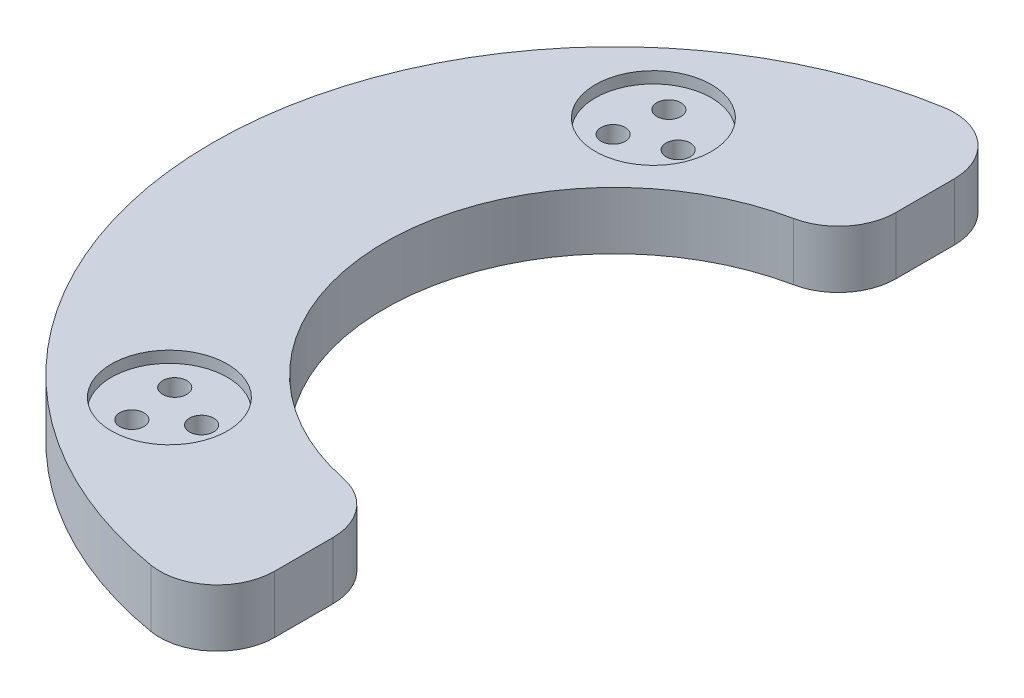
ISO-10303-21;
HEADER;
FILE_DESCRIPTION(('STEP AP214'),'2;1');
FILE_NAME('part.step','',(''),(''),'','','');
FILE_SCHEMA(('AUTOMOTIVE_DESIGN { 1 0 10303 214 1 1 1 1 }'));
ENDSEC;
DATA;
#1=APPLICATION_CONTEXT('core data for automotive mechanical design processes');
#2=APPLICATION_PROTOCOL_DEFINITION('international standard','automotive_design',2000,#1);
#3=PRODUCT_CONTEXT('',#1,'mechanical');
#4=PRODUCT('Part','Part','',(#3));
#5=PRODUCT_RELATED_PRODUCT_CATEGORY('part','',(#4));
#6=PRODUCT_DEFINITION_FORMATION('','',#4);
#7=PRODUCT_DEFINITION_CONTEXT('part definition',#1,'design');
#8=PRODUCT_DEFINITION('design','',#6,#7);
#9=PRODUCT_DEFINITION_SHAPE('','',#8);
#10=(LENGTH_UNIT() NAMED_UNIT(*) SI_UNIT(.MILLI.,.METRE.));
#11=(NAMED_UNIT(*) PLANE_ANGLE_UNIT() SI_UNIT($,.RADIAN.));
#12=(NAMED_UNIT(*) SI_UNIT($,.STERADIAN.) SOLID_ANGLE_UNIT());
#13=UNCERTAINTY_MEASURE_WITH_UNIT(LENGTH_MEASURE(1.E-05),#10,'distance_accuracy_value','');
#14=(GEOMETRIC_REPRESENTATION_CONTEXT(3) GLOBAL_UNCERTAINTY_ASSIGNED_CONTEXT((#13)) GLOBAL_UNIT_ASSIGNED_CONTEXT((#10,
#11,#12)) REPRESENTATION_CONTEXT('',''));
#15=CARTESIAN_POINT('',(0.,0.,0.));
#16=DIRECTION('',(0.,0.,1.));
#17=DIRECTION('',(1.,0.,0.));
#18=AXIS2_PLACEMENT_3D('',#15,#16,#17);
#19=CARTESIAN_POINT('',(0.,10.,0.));
#20=DIRECTION('',(0.,1.,0.));
#21=DIRECTION('',(0.,0.,1.));
#22=AXIS2_PLACEMENT_3D('',#19,#20,#21);
#23=PLANE('',#22);
#24=CARTESIAN_POINT('',(-35.3533185327597,10.,-42.1324443715437));
#25=DIRECTION('',(0.,-1.,0.));
#26=DIRECTION('',(0.,0.,-1.));
#27=AXIS2_PLACEMENT_3D('',#24,#25,#26);
#28=CIRCLE('',#27,10.1);
#29=CARTESIAN_POINT('',(-35.3533185327597,10.,-52.2324443715437));
#30=VERTEX_POINT('',#29);
#31=EDGE_CURVE('E311',#30,#30,#28,.T.);
#32=ORIENTED_EDGE('',*,*,#31,.T.);
#33=EDGE_LOOP('',(#32));
#34=FACE_BOUND('',#33,.T.);
#35=CARTESIAN_POINT('',(-35.3533185327597,10.,42.1324443715437));
#36=DIRECTION('',(0.,1.,0.));
#37=DIRECTION('',(0.,0.,1.));
#38=AXIS2_PLACEMENT_3D('',#35,#36,#37);
#39=CIRCLE('',#38,10.1);
#40=CARTESIAN_POINT('',(-35.3533185327597,10.,52.2324443715437));
#41=VERTEX_POINT('',#40);
#42=EDGE_CURVE('E165',#41,#41,#39,.T.);
#43=ORIENTED_EDGE('',*,*,#42,.F.);
#44=EDGE_LOOP('',(#43));
#45=FACE_BOUND('',#44,.T.);
#46=DIRECTION('',(0.,0.,1.));
#47=VECTOR('',#46,1.);
#48=CARTESIAN_POINT('',(0.,10.,155.526666229488));
#49=LINE('',#48,#47);
#50=CARTESIAN_POINT('',(0.,10.,-59.1607978309962));
#51=VERTEX_POINT('',#50);
#52=CARTESIAN_POINT('',(0.,10.,-48.9897948556636));
#53=VERTEX_POINT('',#52);
#54=EDGE_CURVE('E104',#51,#53,#49,.T.);
#55=ORIENTED_EDGE('',*,*,#54,.F.);
#56=CARTESIAN_POINT('',(-10.,10.,-59.1607978309962));
#57=DIRECTION('',(0.,1.,0.));
#58=DIRECTION('',(0.,0.,1.));
#59=AXIS2_PLACEMENT_3D('',#56,#57,#58);
#60=CIRCLE('',#59,10.);
#61=CARTESIAN_POINT('',(-11.6666666666667,10.,-69.0209308028289));
#62=VERTEX_POINT('',#61);
#63=EDGE_CURVE('E100',#51,#62,#60,.T.);
#64=ORIENTED_EDGE('',*,*,#63,.T.);
#65=CARTESIAN_POINT('',(0.,10.,0.));
#66=DIRECTION('',(0.,1.,0.));
#67=DIRECTION('',(0.,0.,1.));
#68=AXIS2_PLACEMENT_3D('',#65,#66,#67);
#69=CIRCLE('',#68,70.);
#70=CARTESIAN_POINT('',(-11.6666666666667,10.,69.0209308028289));
#71=VERTEX_POINT('',#70);
#72=EDGE_CURVE('E102',#62,#71,#69,.T.);
#73=ORIENTED_EDGE('',*,*,#72,.T.);
#74=CARTESIAN_POINT('',(-10.,10.,59.1607978309962));
#75=DIRECTION('',(0.,1.,0.));
#76=DIRECTION('',(0.,0.,1.));
#77=AXIS2_PLACEMENT_3D('',#74,#75,#76);
#78=CIRCLE('',#77,10.);
#79=CARTESIAN_POINT('',(0.,10.,59.1607978309962));
#80=VERTEX_POINT('',#79);
#81=EDGE_CURVE('E140',#71,#80,#78,.T.);
#82=ORIENTED_EDGE('',*,*,#81,.T.);
#83=CARTESIAN_POINT('',(0.,10.,48.9897948556636));
#84=VERTEX_POINT('',#83);
#85=EDGE_CURVE('E153',#84,#80,#49,.T.);
#86=ORIENTED_EDGE('',*,*,#85,.F.);
#87=CARTESIAN_POINT('',(-10.,10.,48.9897948556636));
#88=DIRECTION('',(0.,1.,0.));
#89=DIRECTION('',(0.,0.,1.));
#90=AXIS2_PLACEMENT_3D('',#87,#88,#89);
#91=CIRCLE('',#90,10.);
#92=CARTESIAN_POINT('',(-8.,10.,39.1918358845309));
#93=VERTEX_POINT('',#92);
#94=EDGE_CURVE('E49',#84,#93,#91,.T.);
#95=ORIENTED_EDGE('',*,*,#94,.T.);
#96=CARTESIAN_POINT('',(0.,10.,0.));
#97=DIRECTION('',(0.,1.,0.));
#98=DIRECTION('',(0.,0.,1.));
#99=AXIS2_PLACEMENT_3D('',#96,#97,#98);
#100=CIRCLE('',#99,40.);
#101=CARTESIAN_POINT('',(-8.,10.,-39.1918358845309));
#102=VERTEX_POINT('',#101);
#103=EDGE_CURVE('E169',#102,#93,#100,.T.);
#104=ORIENTED_EDGE('',*,*,#103,.F.);
#105=CARTESIAN_POINT('',(-10.,10.,-48.9897948556636));
#106=DIRECTION('',(0.,1.,0.));
#107=DIRECTION('',(0.,0.,1.));
#108=AXIS2_PLACEMENT_3D('',#105,#106,#107);
#109=CIRCLE('',#108,10.);
#110=EDGE_CURVE('E109',#102,#53,#109,.T.);
#111=ORIENTED_EDGE('',*,*,#110,.T.);
#112=EDGE_LOOP('',(#55,#64,#73,#82,#86,#95,#104,#111));
#113=FACE_BOUND('',#112,.T.);
#114=ADVANCED_FACE('F34',(#34,#45,#113),#23,.T.);
#115=CARTESIAN_POINT('',(0.,0.,0.));
#116=DIRECTION('',(0.,1.,0.));
#117=DIRECTION('',(0.,0.,1.));
#118=AXIS2_PLACEMENT_3D('',#115,#116,#117);
#119=PLANE('',#118);
#120=CARTESIAN_POINT('',(-37.2738042409347,0.,-46.7489078063275));
#121=DIRECTION('',(0.,1.,0.));
#122=DIRECTION('',(0.,0.,1.));
#123=AXIS2_PLACEMENT_3D('',#120,#121,#122);
#124=CIRCLE('',#123,2.1);
#125=CARTESIAN_POINT('',(-37.2738042409347,0.,-44.6489078063275));
#126=VERTEX_POINT('',#125);
#127=EDGE_CURVE('E336',#126,#126,#124,.F.);
#128=ORIENTED_EDGE('',*,*,#127,.F.);
#129=EDGE_LOOP('',(#128));
#130=FACE_BOUND('',#129,.T.);
#131=CARTESIAN_POINT('',(-30.3951010685075,0.,-41.4874020650363));
#132=DIRECTION('',(0.,1.,0.));
#133=DIRECTION('',(0.,0.,1.));
#134=AXIS2_PLACEMENT_3D('',#131,#132,#133);
#135=CIRCLE('',#134,2.1);
#136=CARTESIAN_POINT('',(-30.3951010685075,0.,-39.3874020650363));
#137=VERTEX_POINT('',#136);
#138=EDGE_CURVE('E341',#137,#137,#135,.F.);
#139=ORIENTED_EDGE('',*,*,#138,.F.);
#140=EDGE_LOOP('',(#139));
#141=FACE_BOUND('',#140,.T.);
#142=CARTESIAN_POINT('',(-38.3910502888369,0.,-38.1610232432674));
#143=DIRECTION('',(0.,1.,0.));
#144=DIRECTION('',(0.,0.,1.));
#145=AXIS2_PLACEMENT_3D('',#142,#143,#144);
#146=CIRCLE('',#145,2.1);
#147=CARTESIAN_POINT('',(-38.3910502888369,0.,-36.0610232432674));
#148=VERTEX_POINT('',#147);
#149=EDGE_CURVE('E344',#148,#148,#146,.F.);
#150=ORIENTED_EDGE('',*,*,#149,.F.);
#151=EDGE_LOOP('',(#150));
#152=FACE_BOUND('',#151,.T.);
#153=CARTESIAN_POINT('',(-37.2738042409347,0.,46.7489078063275));
#154=DIRECTION('',(0.,1.,0.));
#155=DIRECTION('',(0.,0.,1.));
#156=AXIS2_PLACEMENT_3D('',#153,#154,#155);
#157=CIRCLE('',#156,2.1);
#158=CARTESIAN_POINT('',(-37.2738042409347,0.,48.8489078063275));
#159=VERTEX_POINT('',#158);
#160=EDGE_CURVE('E309',#159,#159,#157,.T.);
#161=ORIENTED_EDGE('',*,*,#160,.T.);
#162=EDGE_LOOP('',(#161));
#163=FACE_BOUND('',#162,.T.);
#164=CARTESIAN_POINT('',(-30.3951010685075,0.,41.4874020650363));
#165=DIRECTION('',(0.,1.,0.));
#166=DIRECTION('',(0.,0.,1.));
#167=AXIS2_PLACEMENT_3D('',#164,#165,#166);
#168=CIRCLE('',#167,2.1);
#169=CARTESIAN_POINT('',(-30.3951010685075,0.,43.5874020650363));
#170=VERTEX_POINT('',#169);
#171=EDGE_CURVE('E312',#170,#170,#168,.T.);
#172=ORIENTED_EDGE('',*,*,#171,.T.);
#173=EDGE_LOOP('',(#172));
#174=FACE_BOUND('',#173,.T.);
#175=CARTESIAN_POINT('',(-38.3910502888369,0.,38.1610232432674));
#176=DIRECTION('',(0.,1.,0.));
#177=DIRECTION('',(0.,0.,1.));
#178=AXIS2_PLACEMENT_3D('',#175,#176,#177);
#179=CIRCLE('',#178,2.1);
#180=CARTESIAN_POINT('',(-38.3910502888369,0.,40.2610232432674));
#181=VERTEX_POINT('',#180);
#182=EDGE_CURVE('E317',#181,#181,#179,.T.);
#183=ORIENTED_EDGE('',*,*,#182,.T.);
#184=EDGE_LOOP('',(#183));
#185=FACE_BOUND('',#184,.T.);
#186=CARTESIAN_POINT('',(0.,0.,0.));
#187=DIRECTION('',(0.,1.,0.));
#188=DIRECTION('',(0.,0.,1.));
#189=AXIS2_PLACEMENT_3D('',#186,#187,#188);
#190=CIRCLE('',#189,70.);
#191=CARTESIAN_POINT('',(-11.6666666666667,0.,-69.0209308028289));
#192=VERTEX_POINT('',#191);
#193=CARTESIAN_POINT('',(-11.6666666666667,0.,69.0209308028289));
#194=VERTEX_POINT('',#193);
#195=EDGE_CURVE('E120',#192,#194,#190,.T.);
#196=ORIENTED_EDGE('',*,*,#195,.F.);
#197=CARTESIAN_POINT('',(-10.,0.,-59.1607978309962));
#198=DIRECTION('',(0.,1.,0.));
#199=DIRECTION('',(0.,0.,1.));
#200=AXIS2_PLACEMENT_3D('',#197,#198,#199);
#201=CIRCLE('',#200,10.);
#202=CARTESIAN_POINT('',(0.,0.,-59.1607978309962));
#203=VERTEX_POINT('',#202);
#204=EDGE_CURVE('E123',#192,#203,#201,.F.);
#205=ORIENTED_EDGE('',*,*,#204,.T.);
#206=DIRECTION('',(0.,0.,1.));
#207=VECTOR('',#206,1.);
#208=CARTESIAN_POINT('',(0.,0.,0.));
#209=LINE('',#208,#207);
#210=CARTESIAN_POINT('',(0.,0.,-48.9897948556636));
#211=VERTEX_POINT('',#210);
#212=EDGE_CURVE('E160',#203,#211,#209,.T.);
#213=ORIENTED_EDGE('',*,*,#212,.T.);
#214=CARTESIAN_POINT('',(-10.,0.,-48.9897948556636));
#215=DIRECTION('',(0.,1.,0.));
#216=DIRECTION('',(0.,0.,1.));
#217=AXIS2_PLACEMENT_3D('',#214,#215,#216);
#218=CIRCLE('',#217,10.);
#219=CARTESIAN_POINT('',(-8.,0.,-39.1918358845309));
#220=VERTEX_POINT('',#219);
#221=EDGE_CURVE('E132',#211,#220,#218,.F.);
#222=ORIENTED_EDGE('',*,*,#221,.T.);
#223=CARTESIAN_POINT('',(0.,0.,0.));
#224=DIRECTION('',(0.,1.,0.));
#225=DIRECTION('',(0.,0.,1.));
#226=AXIS2_PLACEMENT_3D('',#223,#224,#225);
#227=CIRCLE('',#226,40.);
#228=CARTESIAN_POINT('',(-8.,0.,39.1918358845309));
#229=VERTEX_POINT('',#228);
#230=EDGE_CURVE('E171',#220,#229,#227,.T.);
#231=ORIENTED_EDGE('',*,*,#230,.T.);
#232=CARTESIAN_POINT('',(-10.,0.,48.9897948556636));
#233=DIRECTION('',(0.,1.,0.));
#234=DIRECTION('',(0.,0.,1.));
#235=AXIS2_PLACEMENT_3D('',#232,#233,#234);
#236=CIRCLE('',#235,10.);
#237=CARTESIAN_POINT('',(0.,0.,48.9897948556636));
#238=VERTEX_POINT('',#237);
#239=EDGE_CURVE('E126',#229,#238,#236,.F.);
#240=ORIENTED_EDGE('',*,*,#239,.T.);
#241=CARTESIAN_POINT('',(0.,0.,59.1607978309962));
#242=VERTEX_POINT('',#241);
#243=EDGE_CURVE('E151',#238,#242,#209,.T.);
#244=ORIENTED_EDGE('',*,*,#243,.T.);
#245=CARTESIAN_POINT('',(-10.,0.,59.1607978309962));
#246=DIRECTION('',(0.,1.,0.));
#247=DIRECTION('',(0.,0.,1.));
#248=AXIS2_PLACEMENT_3D('',#245,#246,#247);
#249=CIRCLE('',#248,10.);
#250=EDGE_CURVE('E124',#242,#194,#249,.F.);
#251=ORIENTED_EDGE('',*,*,#250,.T.);
#252=EDGE_LOOP('',(#196,#205,#213,#222,#231,#240,#244,#251));
#253=FACE_BOUND('',#252,.T.);
#254=ADVANCED_FACE('F157',(#130,#141,#152,#163,#174,#185,#253),#119,.F.);
#255=CARTESIAN_POINT('',(0.,10.,0.));
#256=DIRECTION('',(0.,-1.,0.));
#257=DIRECTION('',(0.,0.,-1.));
#258=AXIS2_PLACEMENT_3D('',#255,#256,#257);
#259=CYLINDRICAL_SURFACE('',#258,70.);
#260=ORIENTED_EDGE('',*,*,#72,.F.);
#261=DIRECTION('',(0.,-1.,0.));
#262=VECTOR('',#261,1.);
#263=CARTESIAN_POINT('',(-11.6666666666667,10.,-69.0209308028289));
#264=LINE('',#263,#262);
#265=EDGE_CURVE('E116',#62,#192,#264,.T.);
#266=ORIENTED_EDGE('',*,*,#265,.T.);
#267=ORIENTED_EDGE('',*,*,#195,.T.);
#268=DIRECTION('',(0.,-1.,0.));
#269=VECTOR('',#268,1.);
#270=CARTESIAN_POINT('',(-11.6666666666667,10.,69.0209308028289));
#271=LINE('',#270,#269);
#272=EDGE_CURVE('E119',#194,#71,#271,.F.);
#273=ORIENTED_EDGE('',*,*,#272,.T.);
#274=EDGE_LOOP('',(#260,#266,#267,#273));
#275=FACE_BOUND('',#274,.T.);
#276=ADVANCED_FACE('F114',(#275),#259,.T.);
#277=CARTESIAN_POINT('',(0.,10.,0.));
#278=DIRECTION('',(0.,-1.,0.));
#279=DIRECTION('',(0.,0.,-1.));
#280=AXIS2_PLACEMENT_3D('',#277,#278,#279);
#281=CYLINDRICAL_SURFACE('',#280,40.);
#282=ORIENTED_EDGE('',*,*,#230,.F.);
#283=DIRECTION('',(0.,-1.,0.));
#284=VECTOR('',#283,1.);
#285=CARTESIAN_POINT('',(-8.,10.,-39.1918358845309));
#286=LINE('',#285,#284);
#287=EDGE_CURVE('E56',#220,#102,#286,.F.);
#288=ORIENTED_EDGE('',*,*,#287,.T.);
#289=ORIENTED_EDGE('',*,*,#103,.T.);
#290=DIRECTION('',(0.,-1.,0.));
#291=VECTOR('',#290,1.);
#292=CARTESIAN_POINT('',(-8.,10.,39.1918358845309));
#293=LINE('',#292,#291);
#294=EDGE_CURVE('E108',#93,#229,#293,.T.);
#295=ORIENTED_EDGE('',*,*,#294,.T.);
#296=EDGE_LOOP('',(#282,#288,#289,#295));
#297=FACE_BOUND('',#296,.T.);
#298=ADVANCED_FACE('F180',(#297),#281,.F.);
#299=CARTESIAN_POINT('',(0.,-52.,155.526666229488));
#300=DIRECTION('',(-1.,0.,0.));
#301=DIRECTION('',(0.,0.,1.));
#302=AXIS2_PLACEMENT_3D('',#299,#300,#301);
#303=PLANE('',#302);
#304=ORIENTED_EDGE('',*,*,#243,.F.);
#305=DIRECTION('',(0.,1.,0.));
#306=VECTOR('',#305,1.);
#307=CARTESIAN_POINT('',(0.,10.,48.9897948556636));
#308=LINE('',#307,#306);
#309=EDGE_CURVE('E11',#238,#84,#308,.T.);
#310=ORIENTED_EDGE('',*,*,#309,.T.);
#311=ORIENTED_EDGE('',*,*,#85,.T.);
#312=DIRECTION('',(0.,-1.,0.));
#313=VECTOR('',#312,1.);
#314=CARTESIAN_POINT('',(0.,-52.,59.1607978309962));
#315=LINE('',#314,#313);
#316=EDGE_CURVE('E42',#80,#242,#315,.T.);
#317=ORIENTED_EDGE('',*,*,#316,.T.);
#318=EDGE_LOOP('',(#304,#310,#311,#317));
#319=FACE_BOUND('',#318,.T.);
#320=ADVANCED_FACE('F150',(#319),#303,.F.);
#321=ORIENTED_EDGE('',*,*,#212,.F.);
#322=DIRECTION('',(0.,-1.,0.));
#323=VECTOR('',#322,1.);
#324=CARTESIAN_POINT('',(0.,-52.,-59.1607978309962));
#325=LINE('',#324,#323);
#326=EDGE_CURVE('E138',#203,#51,#325,.F.);
#327=ORIENTED_EDGE('',*,*,#326,.T.);
#328=ORIENTED_EDGE('',*,*,#54,.T.);
#329=DIRECTION('',(0.,1.,0.));
#330=VECTOR('',#329,1.);
#331=CARTESIAN_POINT('',(0.,0.,-48.9897948556636));
#332=LINE('',#331,#330);
#333=EDGE_CURVE('E135',#53,#211,#332,.F.);
#334=ORIENTED_EDGE('',*,*,#333,.T.);
#335=EDGE_LOOP('',(#321,#327,#328,#334));
#336=FACE_BOUND('',#335,.T.);
#337=ADVANCED_FACE('F175',(#336),#303,.F.);
#338=CARTESIAN_POINT('',(-35.3533185327597,8.,42.1324443715437));
#339=DIRECTION('',(0.,1.,0.));
#340=DIRECTION('',(0.,0.,1.));
#341=AXIS2_PLACEMENT_3D('',#338,#339,#340);
#342=CYLINDRICAL_SURFACE('',#341,10.1);
#343=CARTESIAN_POINT('',(-35.3533185327597,8.,42.1324443715437));
#344=DIRECTION('',(0.,1.,0.));
#345=DIRECTION('',(0.,0.,1.));
#346=AXIS2_PLACEMENT_3D('',#343,#344,#345);
#347=CIRCLE('',#346,10.1);
#348=CARTESIAN_POINT('',(-35.3533185327597,8.,52.2324443715437));
#349=VERTEX_POINT('',#348);
#350=EDGE_CURVE('E162',#349,#349,#347,.T.);
#351=ORIENTED_EDGE('',*,*,#350,.F.);
#352=EDGE_LOOP('',(#351));
#353=FACE_BOUND('',#352,.T.);
#354=ORIENTED_EDGE('',*,*,#42,.T.);
#355=EDGE_LOOP('',(#354));
#356=FACE_BOUND('',#355,.T.);
#357=ADVANCED_FACE('F227',(#353,#356),#342,.F.);
#358=CARTESIAN_POINT('',(-35.3533185327597,8.,42.1324443715437));
#359=DIRECTION('',(0.,1.,0.));
#360=DIRECTION('',(0.,0.,1.));
#361=AXIS2_PLACEMENT_3D('',#358,#359,#360);
#362=PLANE('',#361);
#363=CARTESIAN_POINT('',(-37.2738042409347,8.,46.7489078063275));
#364=DIRECTION('',(0.,1.,0.));
#365=DIRECTION('',(0.,0.,1.));
#366=AXIS2_PLACEMENT_3D('',#363,#364,#365);
#367=CIRCLE('',#366,2.1);
#368=CARTESIAN_POINT('',(-37.2738042409347,8.,48.8489078063275));
#369=VERTEX_POINT('',#368);
#370=EDGE_CURVE('E306',#369,#369,#367,.T.);
#371=ORIENTED_EDGE('',*,*,#370,.F.);
#372=EDGE_LOOP('',(#371));
#373=FACE_BOUND('',#372,.T.);
#374=CARTESIAN_POINT('',(-30.3951010685075,8.,41.4874020650363));
#375=DIRECTION('',(0.,1.,0.));
#376=DIRECTION('',(0.,0.,1.));
#377=AXIS2_PLACEMENT_3D('',#374,#375,#376);
#378=CIRCLE('',#377,2.1);
#379=CARTESIAN_POINT('',(-30.3951010685075,8.,43.5874020650363));
#380=VERTEX_POINT('',#379);
#381=EDGE_CURVE('E334',#380,#380,#378,.T.);
#382=ORIENTED_EDGE('',*,*,#381,.F.);
#383=EDGE_LOOP('',(#382));
#384=FACE_BOUND('',#383,.T.);
#385=CARTESIAN_POINT('',(-38.3910502888369,8.,38.1610232432674));
#386=DIRECTION('',(0.,1.,0.));
#387=DIRECTION('',(0.,0.,1.));
#388=AXIS2_PLACEMENT_3D('',#385,#386,#387);
#389=CIRCLE('',#388,2.1);
#390=CARTESIAN_POINT('',(-38.3910502888369,8.,40.2610232432674));
#391=VERTEX_POINT('',#390);
#392=EDGE_CURVE('E331',#391,#391,#389,.T.);
#393=ORIENTED_EDGE('',*,*,#392,.F.);
#394=EDGE_LOOP('',(#393));
#395=FACE_BOUND('',#394,.T.);
#396=ORIENTED_EDGE('',*,*,#350,.T.);
#397=EDGE_LOOP('',(#396));
#398=FACE_BOUND('',#397,.T.);
#399=ADVANCED_FACE('F217',(#373,#384,#395,#398),#362,.T.);
#400=CARTESIAN_POINT('',(-35.3533185327597,8.,-42.1324443715437));
#401=DIRECTION('',(0.,1.,0.));
#402=DIRECTION('',(0.,0.,1.));
#403=AXIS2_PLACEMENT_3D('',#400,#401,#402);
#404=CYLINDRICAL_SURFACE('',#403,10.1);
#405=CARTESIAN_POINT('',(-35.3533185327597,8.,-42.1324443715437));
#406=DIRECTION('',(0.,-1.,0.));
#407=DIRECTION('',(0.,0.,-1.));
#408=AXIS2_PLACEMENT_3D('',#405,#406,#407);
#409=CIRCLE('',#408,10.1);
#410=CARTESIAN_POINT('',(-35.3533185327597,8.,-52.2324443715437));
#411=VERTEX_POINT('',#410);
#412=EDGE_CURVE('E314',#411,#411,#409,.T.);
#413=ORIENTED_EDGE('',*,*,#412,.T.);
#414=EDGE_LOOP('',(#413));
#415=FACE_BOUND('',#414,.T.);
#416=ORIENTED_EDGE('',*,*,#31,.F.);
#417=EDGE_LOOP('',(#416));
#418=FACE_BOUND('',#417,.T.);
#419=ADVANCED_FACE('F211',(#415,#418),#404,.F.);
#420=CARTESIAN_POINT('',(-35.3533185327597,8.,-42.1324443715437));
#421=DIRECTION('',(0.,1.,0.));
#422=DIRECTION('',(0.,0.,-1.));
#423=AXIS2_PLACEMENT_3D('',#420,#421,#422);
#424=PLANE('',#423);
#425=CARTESIAN_POINT('',(-37.2738042409347,8.,-46.7489078063275));
#426=DIRECTION('',(0.,-1.,0.));
#427=DIRECTION('',(0.,0.,-1.));
#428=AXIS2_PLACEMENT_3D('',#425,#426,#427);
#429=CIRCLE('',#428,2.1);
#430=CARTESIAN_POINT('',(-37.2738042409347,8.,-48.8489078063275));
#431=VERTEX_POINT('',#430);
#432=EDGE_CURVE('E351',#431,#431,#429,.T.);
#433=ORIENTED_EDGE('',*,*,#432,.T.);
#434=EDGE_LOOP('',(#433));
#435=FACE_BOUND('',#434,.T.);
#436=CARTESIAN_POINT('',(-30.3951010685075,8.,-41.4874020650363));
#437=DIRECTION('',(0.,-1.,0.));
#438=DIRECTION('',(0.,0.,-1.));
#439=AXIS2_PLACEMENT_3D('',#436,#437,#438);
#440=CIRCLE('',#439,2.1);
#441=CARTESIAN_POINT('',(-30.3951010685075,8.,-43.5874020650363));
#442=VERTEX_POINT('',#441);
#443=EDGE_CURVE('E350',#442,#442,#440,.T.);
#444=ORIENTED_EDGE('',*,*,#443,.T.);
#445=EDGE_LOOP('',(#444));
#446=FACE_BOUND('',#445,.T.);
#447=CARTESIAN_POINT('',(-38.3910502888369,8.,-38.1610232432674));
#448=DIRECTION('',(0.,-1.,0.));
#449=DIRECTION('',(0.,0.,-1.));
#450=AXIS2_PLACEMENT_3D('',#447,#448,#449);
#451=CIRCLE('',#450,2.1);
#452=CARTESIAN_POINT('',(-38.3910502888369,8.,-40.2610232432674));
#453=VERTEX_POINT('',#452);
#454=EDGE_CURVE('E347',#453,#453,#451,.T.);
#455=ORIENTED_EDGE('',*,*,#454,.T.);
#456=EDGE_LOOP('',(#455));
#457=FACE_BOUND('',#456,.T.);
#458=ORIENTED_EDGE('',*,*,#412,.F.);
#459=EDGE_LOOP('',(#458));
#460=FACE_BOUND('',#459,.T.);
#461=ADVANCED_FACE('F207',(#435,#446,#457,#460),#424,.T.);
#462=CARTESIAN_POINT('',(-10.,10.,-59.1607978309962));
#463=DIRECTION('',(0.,-1.,0.));
#464=DIRECTION('',(0.,0.,-1.));
#465=AXIS2_PLACEMENT_3D('',#462,#463,#464);
#466=CYLINDRICAL_SURFACE('',#465,10.);
#467=ORIENTED_EDGE('',*,*,#63,.F.);
#468=ORIENTED_EDGE('',*,*,#326,.F.);
#469=ORIENTED_EDGE('',*,*,#204,.F.);
#470=ORIENTED_EDGE('',*,*,#265,.F.);
#471=EDGE_LOOP('',(#467,#468,#469,#470));
#472=FACE_BOUND('',#471,.T.);
#473=ADVANCED_FACE('F122',(#472),#466,.T.);
#474=CARTESIAN_POINT('',(-10.,10.,-48.9897948556636));
#475=DIRECTION('',(0.,-1.,0.));
#476=DIRECTION('',(0.,0.,-1.));
#477=AXIS2_PLACEMENT_3D('',#474,#475,#476);
#478=CYLINDRICAL_SURFACE('',#477,10.);
#479=ORIENTED_EDGE('',*,*,#110,.F.);
#480=ORIENTED_EDGE('',*,*,#287,.F.);
#481=ORIENTED_EDGE('',*,*,#221,.F.);
#482=ORIENTED_EDGE('',*,*,#333,.F.);
#483=EDGE_LOOP('',(#479,#480,#481,#482));
#484=FACE_BOUND('',#483,.T.);
#485=ADVANCED_FACE('F179',(#484),#478,.T.);
#486=CARTESIAN_POINT('',(-10.,10.,48.9897948556636));
#487=DIRECTION('',(0.,-1.,0.));
#488=DIRECTION('',(0.,0.,-1.));
#489=AXIS2_PLACEMENT_3D('',#486,#487,#488);
#490=CYLINDRICAL_SURFACE('',#489,10.);
#491=ORIENTED_EDGE('',*,*,#239,.F.);
#492=ORIENTED_EDGE('',*,*,#294,.F.);
#493=ORIENTED_EDGE('',*,*,#94,.F.);
#494=ORIENTED_EDGE('',*,*,#309,.F.);
#495=EDGE_LOOP('',(#491,#492,#493,#494));
#496=FACE_BOUND('',#495,.T.);
#497=ADVANCED_FACE('F183',(#496),#490,.T.);
#498=CARTESIAN_POINT('',(-10.,10.,59.1607978309962));
#499=DIRECTION('',(0.,-1.,0.));
#500=DIRECTION('',(0.,0.,-1.));
#501=AXIS2_PLACEMENT_3D('',#498,#499,#500);
#502=CYLINDRICAL_SURFACE('',#501,10.);
#503=ORIENTED_EDGE('',*,*,#250,.F.);
#504=ORIENTED_EDGE('',*,*,#316,.F.);
#505=ORIENTED_EDGE('',*,*,#81,.F.);
#506=ORIENTED_EDGE('',*,*,#272,.F.);
#507=EDGE_LOOP('',(#503,#504,#505,#506));
#508=FACE_BOUND('',#507,.T.);
#509=ADVANCED_FACE('F36',(#508),#502,.T.);
#510=CARTESIAN_POINT('',(-38.3910502888369,-2.,38.1610232432674));
#511=DIRECTION('',(0.,1.,0.));
#512=DIRECTION('',(0.,0.,1.));
#513=AXIS2_PLACEMENT_3D('',#510,#511,#512);
#514=CYLINDRICAL_SURFACE('',#513,2.1);
#515=ORIENTED_EDGE('',*,*,#392,.T.);
#516=EDGE_LOOP('',(#515));
#517=FACE_BOUND('',#516,.T.);
#518=ORIENTED_EDGE('',*,*,#182,.F.);
#519=EDGE_LOOP('',(#518));
#520=FACE_BOUND('',#519,.T.);
#521=ADVANCED_FACE('F189',(#517,#520),#514,.F.);
#522=CARTESIAN_POINT('',(-30.3951010685075,-2.,41.4874020650363));
#523=DIRECTION('',(0.,1.,0.));
#524=DIRECTION('',(0.,0.,1.));
#525=AXIS2_PLACEMENT_3D('',#522,#523,#524);
#526=CYLINDRICAL_SURFACE('',#525,2.1);
#527=ORIENTED_EDGE('',*,*,#381,.T.);
#528=EDGE_LOOP('',(#527));
#529=FACE_BOUND('',#528,.T.);
#530=ORIENTED_EDGE('',*,*,#171,.F.);
#531=EDGE_LOOP('',(#530));
#532=FACE_BOUND('',#531,.T.);
#533=ADVANCED_FACE('F298',(#529,#532),#526,.F.);
#534=CARTESIAN_POINT('',(-37.2738042409347,-2.,46.7489078063275));
#535=DIRECTION('',(0.,1.,0.));
#536=DIRECTION('',(0.,0.,1.));
#537=AXIS2_PLACEMENT_3D('',#534,#535,#536);
#538=CYLINDRICAL_SURFACE('',#537,2.1);
#539=ORIENTED_EDGE('',*,*,#370,.T.);
#540=EDGE_LOOP('',(#539));
#541=FACE_BOUND('',#540,.T.);
#542=ORIENTED_EDGE('',*,*,#160,.F.);
#543=EDGE_LOOP('',(#542));
#544=FACE_BOUND('',#543,.T.);
#545=ADVANCED_FACE('F254',(#541,#544),#538,.F.);
#546=CARTESIAN_POINT('',(-38.3910502888369,-2.,-38.1610232432674));
#547=DIRECTION('',(0.,1.,0.));
#548=DIRECTION('',(0.,0.,1.));
#549=AXIS2_PLACEMENT_3D('',#546,#547,#548);
#550=CYLINDRICAL_SURFACE('',#549,2.1);
#551=ORIENTED_EDGE('',*,*,#454,.F.);
#552=EDGE_LOOP('',(#551));
#553=FACE_BOUND('',#552,.T.);
#554=ORIENTED_EDGE('',*,*,#149,.T.);
#555=EDGE_LOOP('',(#554));
#556=FACE_BOUND('',#555,.T.);
#557=ADVANCED_FACE('F266',(#553,#556),#550,.F.);
#558=CARTESIAN_POINT('',(-30.3951010685075,-2.,-41.4874020650363));
#559=DIRECTION('',(0.,1.,0.));
#560=DIRECTION('',(0.,0.,1.));
#561=AXIS2_PLACEMENT_3D('',#558,#559,#560);
#562=CYLINDRICAL_SURFACE('',#561,2.1);
#563=ORIENTED_EDGE('',*,*,#443,.F.);
#564=EDGE_LOOP('',(#563));
#565=FACE_BOUND('',#564,.T.);
#566=ORIENTED_EDGE('',*,*,#138,.T.);
#567=EDGE_LOOP('',(#566));
#568=FACE_BOUND('',#567,.T.);
#569=ADVANCED_FACE('F271',(#565,#568),#562,.F.);
#570=CARTESIAN_POINT('',(-37.2738042409347,-2.,-46.7489078063275));
#571=DIRECTION('',(0.,1.,0.));
#572=DIRECTION('',(0.,0.,1.));
#573=AXIS2_PLACEMENT_3D('',#570,#571,#572);
#574=CYLINDRICAL_SURFACE('',#573,2.1);
#575=ORIENTED_EDGE('',*,*,#432,.F.);
#576=EDGE_LOOP('',(#575));
#577=FACE_BOUND('',#576,.T.);
#578=ORIENTED_EDGE('',*,*,#127,.T.);
#579=EDGE_LOOP('',(#578));
#580=FACE_BOUND('',#579,.T.);
#581=ADVANCED_FACE('F281',(#577,#580),#574,.F.);
#582=CLOSED_SHELL('',(#114,#254,#276,#298,#320,#337,#357,#399,#419,#461,#473,#485,#497,#509,
#521,#533,#545,#557,#569,#581));
#583=MANIFOLD_SOLID_BREP('B2',#582);
#584=ADVANCED_BREP_SHAPE_REPRESENTATION('',(#18,#583),#14);
#585=SHAPE_DEFINITION_REPRESENTATION(#9,#584);
ENDSEC;
END-ISO-10303-21;
